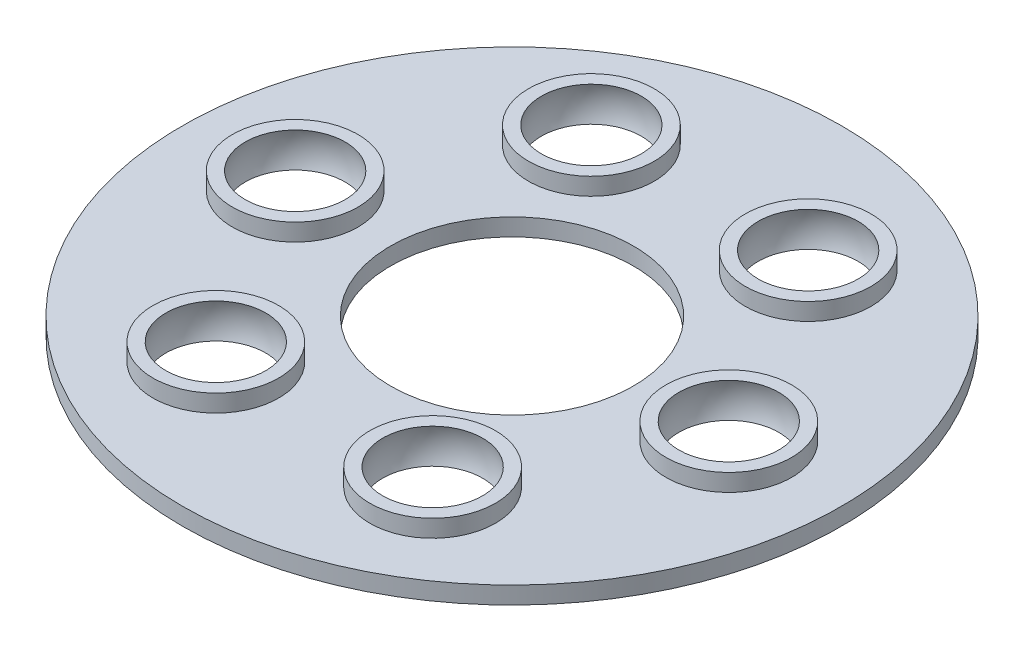
ISO-10303-21;
HEADER;
FILE_DESCRIPTION(('STEP AP214'),'2;1');
FILE_NAME('part.step','',(''),(''),'','','');
FILE_SCHEMA(('AUTOMOTIVE_DESIGN { 1 0 10303 214 1 1 1 1 }'));
ENDSEC;
DATA;
#1=APPLICATION_CONTEXT('core data for automotive mechanical design processes');
#2=APPLICATION_PROTOCOL_DEFINITION('international standard','automotive_design',2000,#1);
#3=PRODUCT_CONTEXT('',#1,'mechanical');
#4=PRODUCT('Part','Part','',(#3));
#5=PRODUCT_RELATED_PRODUCT_CATEGORY('part','',(#4));
#6=PRODUCT_DEFINITION_FORMATION('','',#4);
#7=PRODUCT_DEFINITION_CONTEXT('part definition',#1,'design');
#8=PRODUCT_DEFINITION('design','',#6,#7);
#9=PRODUCT_DEFINITION_SHAPE('','',#8);
#10=(LENGTH_UNIT() NAMED_UNIT(*) SI_UNIT(.MILLI.,.METRE.));
#11=(NAMED_UNIT(*) PLANE_ANGLE_UNIT() SI_UNIT($,.RADIAN.));
#12=(NAMED_UNIT(*) SI_UNIT($,.STERADIAN.) SOLID_ANGLE_UNIT());
#13=UNCERTAINTY_MEASURE_WITH_UNIT(LENGTH_MEASURE(1.E-05),#10,'distance_accuracy_value','');
#14=(GEOMETRIC_REPRESENTATION_CONTEXT(3) GLOBAL_UNCERTAINTY_ASSIGNED_CONTEXT((#13)) GLOBAL_UNIT_ASSIGNED_CONTEXT((#10,
#11,#12)) REPRESENTATION_CONTEXT('',''));
#15=CARTESIAN_POINT('',(0.,0.,0.));
#16=DIRECTION('',(0.,0.,1.));
#17=DIRECTION('',(1.,0.,0.));
#18=AXIS2_PLACEMENT_3D('',#15,#16,#17);
#19=CARTESIAN_POINT('',(0.,1.,0.));
#20=DIRECTION('',(0.,1.,0.));
#21=DIRECTION('',(0.,0.,1.));
#22=AXIS2_PLACEMENT_3D('',#19,#20,#21);
#23=PLANE('',#22);
#24=CARTESIAN_POINT('',(6.2499999999999,1.,-10.8253175473055));
#25=DIRECTION('',(0.,1.,0.));
#26=DIRECTION('',(-0.499999999999992,0.,0.866025403784443));
#27=AXIS2_PLACEMENT_3D('',#24,#25,#26);
#28=CIRCLE('',#27,3.625);
#29=CARTESIAN_POINT('',(4.43749999999993,1.,-7.68597545858694));
#30=VERTEX_POINT('',#29);
#31=EDGE_CURVE('E146',#30,#30,#28,.T.);
#32=ORIENTED_EDGE('',*,*,#31,.F.);
#33=EDGE_LOOP('',(#32));
#34=FACE_BOUND('',#33,.T.);
#35=CARTESIAN_POINT('',(6.25000000000005,1.,10.8253175473055));
#36=DIRECTION('',(0.,1.,0.));
#37=DIRECTION('',(-0.500000000000004,0.,-0.866025403784436));
#38=AXIS2_PLACEMENT_3D('',#35,#36,#37);
#39=CIRCLE('',#38,3.625);
#40=CARTESIAN_POINT('',(4.43750000000004,1.,7.68597545858687));
#41=VERTEX_POINT('',#40);
#42=EDGE_CURVE('E162',#41,#41,#39,.T.);
#43=ORIENTED_EDGE('',*,*,#42,.F.);
#44=EDGE_LOOP('',(#43));
#45=FACE_BOUND('',#44,.T.);
#46=CARTESIAN_POINT('',(-12.5,1.,0.));
#47=DIRECTION('',(0.,1.,0.));
#48=DIRECTION('',(1.,0.,0.));
#49=AXIS2_PLACEMENT_3D('',#46,#47,#48);
#50=CIRCLE('',#49,3.625);
#51=CARTESIAN_POINT('',(-8.875,1.,0.));
#52=VERTEX_POINT('',#51);
#53=EDGE_CURVE('E183',#52,#52,#50,.T.);
#54=ORIENTED_EDGE('',*,*,#53,.F.);
#55=EDGE_LOOP('',(#54));
#56=FACE_BOUND('',#55,.T.);
#57=CARTESIAN_POINT('',(0.,1.,0.));
#58=DIRECTION('',(0.,1.,0.));
#59=DIRECTION('',(0.,0.,1.));
#60=AXIS2_PLACEMENT_3D('',#57,#58,#59);
#61=CIRCLE('',#60,19.);
#62=CARTESIAN_POINT('',(0.,1.,19.));
#63=VERTEX_POINT('',#62);
#64=EDGE_CURVE('E11',#63,#63,#61,.T.);
#65=ORIENTED_EDGE('',*,*,#64,.T.);
#66=EDGE_LOOP('',(#65));
#67=FACE_BOUND('',#66,.T.);
#68=CARTESIAN_POINT('',(0.,1.,0.));
#69=DIRECTION('',(0.,1.,0.));
#70=DIRECTION('',(0.,0.,1.));
#71=AXIS2_PLACEMENT_3D('',#68,#69,#70);
#72=CIRCLE('',#71,7.);
#73=CARTESIAN_POINT('',(0.,1.,7.));
#74=VERTEX_POINT('',#73);
#75=EDGE_CURVE('E88',#74,#74,#72,.T.);
#76=ORIENTED_EDGE('',*,*,#75,.F.);
#77=EDGE_LOOP('',(#76));
#78=FACE_BOUND('',#77,.T.);
#79=CARTESIAN_POINT('',(-6.24999999999998,1.,10.8253175473055));
#80=DIRECTION('',(0.,1.,0.));
#81=DIRECTION('',(0.499999999999998,0.,-0.86602540378444));
#82=AXIS2_PLACEMENT_3D('',#79,#80,#81);
#83=CIRCLE('',#82,3.625);
#84=CARTESIAN_POINT('',(-4.43749999999998,1.,7.6859754585869));
#85=VERTEX_POINT('',#84);
#86=EDGE_CURVE('E170',#85,#85,#83,.T.);
#87=ORIENTED_EDGE('',*,*,#86,.F.);
#88=EDGE_LOOP('',(#87));
#89=FACE_BOUND('',#88,.T.);
#90=CARTESIAN_POINT('',(12.5,1.,0.));
#91=DIRECTION('',(0.,1.,0.));
#92=DIRECTION('',(-1.,0.,0.));
#93=AXIS2_PLACEMENT_3D('',#90,#91,#92);
#94=CIRCLE('',#93,3.625);
#95=CARTESIAN_POINT('',(8.875,1.,0.));
#96=VERTEX_POINT('',#95);
#97=EDGE_CURVE('E154',#96,#96,#94,.T.);
#98=ORIENTED_EDGE('',*,*,#97,.F.);
#99=EDGE_LOOP('',(#98));
#100=FACE_BOUND('',#99,.T.);
#101=CARTESIAN_POINT('',(-6.25000000000013,1.,-10.8253175473054));
#102=DIRECTION('',(0.,1.,0.));
#103=DIRECTION('',(0.50000000000001,0.,0.866025403784433));
#104=AXIS2_PLACEMENT_3D('',#101,#102,#103);
#105=CIRCLE('',#104,3.625);
#106=CARTESIAN_POINT('',(-4.43750000000009,1.,-7.68597545858684));
#107=VERTEX_POINT('',#106);
#108=EDGE_CURVE('E141',#107,#107,#105,.T.);
#109=ORIENTED_EDGE('',*,*,#108,.F.);
#110=EDGE_LOOP('',(#109));
#111=FACE_BOUND('',#110,.T.);
#112=ADVANCED_FACE('F73',(#34,#45,#56,#67,#78,#89,#100,#111),#23,.T.);
#113=CARTESIAN_POINT('',(0.,0.,0.));
#114=DIRECTION('',(0.,1.,0.));
#115=DIRECTION('',(0.,0.,1.));
#116=AXIS2_PLACEMENT_3D('',#113,#114,#115);
#117=PLANE('',#116);
#118=CARTESIAN_POINT('',(-6.25000000000013,0.,-10.8253175473054));
#119=DIRECTION('',(0.,1.,0.));
#120=DIRECTION('',(0.,0.,1.));
#121=AXIS2_PLACEMENT_3D('',#118,#119,#120);
#122=CIRCLE('',#121,2.88140590684478);
#123=CARTESIAN_POINT('',(-6.25000000000013,0.,-7.94391164046063));
#124=VERTEX_POINT('',#123);
#125=EDGE_CURVE('E118',#124,#124,#122,.T.);
#126=ORIENTED_EDGE('',*,*,#125,.T.);
#127=EDGE_LOOP('',(#126));
#128=FACE_BOUND('',#127,.T.);
#129=CARTESIAN_POINT('',(6.2499999999999,0.,-10.8253175473055));
#130=DIRECTION('',(0.,1.,0.));
#131=DIRECTION('',(0.,0.,1.));
#132=AXIS2_PLACEMENT_3D('',#129,#130,#131);
#133=CIRCLE('',#132,2.88140590684478);
#134=CARTESIAN_POINT('',(6.2499999999999,0.,-7.94391164046076));
#135=VERTEX_POINT('',#134);
#136=EDGE_CURVE('E114',#135,#135,#133,.T.);
#137=ORIENTED_EDGE('',*,*,#136,.T.);
#138=EDGE_LOOP('',(#137));
#139=FACE_BOUND('',#138,.T.);
#140=CARTESIAN_POINT('',(12.5,0.,0.));
#141=DIRECTION('',(0.,1.,0.));
#142=DIRECTION('',(0.,0.,1.));
#143=AXIS2_PLACEMENT_3D('',#140,#141,#142);
#144=CIRCLE('',#143,2.88140590684478);
#145=CARTESIAN_POINT('',(12.5,0.,2.88140590684478));
#146=VERTEX_POINT('',#145);
#147=EDGE_CURVE('E110',#146,#146,#144,.T.);
#148=ORIENTED_EDGE('',*,*,#147,.T.);
#149=EDGE_LOOP('',(#148));
#150=FACE_BOUND('',#149,.T.);
#151=CARTESIAN_POINT('',(6.25000000000005,0.,10.8253175473055));
#152=DIRECTION('',(0.,1.,0.));
#153=DIRECTION('',(0.,0.,1.));
#154=AXIS2_PLACEMENT_3D('',#151,#152,#153);
#155=CIRCLE('',#154,2.88140590684478);
#156=CARTESIAN_POINT('',(6.25000000000005,0.,13.7067234541502));
#157=VERTEX_POINT('',#156);
#158=EDGE_CURVE('E105',#157,#157,#155,.T.);
#159=ORIENTED_EDGE('',*,*,#158,.T.);
#160=EDGE_LOOP('',(#159));
#161=FACE_BOUND('',#160,.T.);
#162=CARTESIAN_POINT('',(-6.24999999999998,0.,10.8253175473055));
#163=DIRECTION('',(0.,1.,0.));
#164=DIRECTION('',(0.,0.,1.));
#165=AXIS2_PLACEMENT_3D('',#162,#163,#164);
#166=CIRCLE('',#165,2.88140590684478);
#167=CARTESIAN_POINT('',(-6.24999999999998,0.,13.7067234541503));
#168=VERTEX_POINT('',#167);
#169=EDGE_CURVE('E104',#168,#168,#166,.T.);
#170=ORIENTED_EDGE('',*,*,#169,.T.);
#171=EDGE_LOOP('',(#170));
#172=FACE_BOUND('',#171,.T.);
#173=CARTESIAN_POINT('',(-12.5,0.,0.));
#174=DIRECTION('',(0.,1.,0.));
#175=DIRECTION('',(0.,0.,1.));
#176=AXIS2_PLACEMENT_3D('',#173,#174,#175);
#177=CIRCLE('',#176,2.88140590684478);
#178=CARTESIAN_POINT('',(-12.5,0.,2.88140590684478));
#179=VERTEX_POINT('',#178);
#180=EDGE_CURVE('E98',#179,#179,#177,.T.);
#181=ORIENTED_EDGE('',*,*,#180,.T.);
#182=EDGE_LOOP('',(#181));
#183=FACE_BOUND('',#182,.T.);
#184=CARTESIAN_POINT('',(0.,0.,0.));
#185=DIRECTION('',(0.,1.,0.));
#186=DIRECTION('',(0.,0.,1.));
#187=AXIS2_PLACEMENT_3D('',#184,#185,#186);
#188=CIRCLE('',#187,19.);
#189=CARTESIAN_POINT('',(0.,0.,19.));
#190=VERTEX_POINT('',#189);
#191=EDGE_CURVE('E82',#190,#190,#188,.T.);
#192=ORIENTED_EDGE('',*,*,#191,.F.);
#193=EDGE_LOOP('',(#192));
#194=FACE_BOUND('',#193,.T.);
#195=CARTESIAN_POINT('',(0.,0.,0.));
#196=DIRECTION('',(0.,1.,0.));
#197=DIRECTION('',(0.,0.,1.));
#198=AXIS2_PLACEMENT_3D('',#195,#196,#197);
#199=CIRCLE('',#198,7.);
#200=CARTESIAN_POINT('',(0.,0.,7.));
#201=VERTEX_POINT('',#200);
#202=EDGE_CURVE('E91',#201,#201,#199,.T.);
#203=ORIENTED_EDGE('',*,*,#202,.T.);
#204=EDGE_LOOP('',(#203));
#205=FACE_BOUND('',#204,.T.);
#206=ADVANCED_FACE('F198',(#128,#139,#150,#161,#172,#183,#194,#205),#117,.F.);
#207=CARTESIAN_POINT('',(0.,1.,0.));
#208=DIRECTION('',(0.,-1.,0.));
#209=DIRECTION('',(0.,0.,-1.));
#210=AXIS2_PLACEMENT_3D('',#207,#208,#209);
#211=CYLINDRICAL_SURFACE('',#210,19.);
#212=ORIENTED_EDGE('',*,*,#64,.F.);
#213=EDGE_LOOP('',(#212));
#214=FACE_BOUND('',#213,.T.);
#215=ORIENTED_EDGE('',*,*,#191,.T.);
#216=EDGE_LOOP('',(#215));
#217=FACE_BOUND('',#216,.T.);
#218=ADVANCED_FACE('F75',(#214,#217),#211,.T.);
#219=CARTESIAN_POINT('',(0.,1.,0.));
#220=DIRECTION('',(0.,-1.,0.));
#221=DIRECTION('',(0.,0.,-1.));
#222=AXIS2_PLACEMENT_3D('',#219,#220,#221);
#223=CYLINDRICAL_SURFACE('',#222,7.);
#224=ORIENTED_EDGE('',*,*,#75,.T.);
#225=EDGE_LOOP('',(#224));
#226=FACE_BOUND('',#225,.T.);
#227=ORIENTED_EDGE('',*,*,#202,.F.);
#228=EDGE_LOOP('',(#227));
#229=FACE_BOUND('',#228,.T.);
#230=ADVANCED_FACE('F200',(#226,#229),#223,.F.);
#231=CARTESIAN_POINT('',(-12.5,2.,0.));
#232=DIRECTION('',(0.,1.,0.));
#233=DIRECTION('',(0.,0.,1.));
#234=AXIS2_PLACEMENT_3D('',#231,#232,#233);
#235=PLANE('',#234);
#236=CARTESIAN_POINT('',(-12.5,2.,0.));
#237=DIRECTION('',(0.,1.,0.));
#238=DIRECTION('',(0.,0.,1.));
#239=AXIS2_PLACEMENT_3D('',#236,#237,#238);
#240=CIRCLE('',#239,2.88140590684478);
#241=CARTESIAN_POINT('',(-12.5,2.,2.88140590684478));
#242=VERTEX_POINT('',#241);
#243=EDGE_CURVE('E94',#242,#242,#240,.T.);
#244=ORIENTED_EDGE('',*,*,#243,.F.);
#245=EDGE_LOOP('',(#244));
#246=FACE_BOUND('',#245,.T.);
#247=CARTESIAN_POINT('',(-12.5,2.,0.));
#248=DIRECTION('',(0.,1.,0.));
#249=DIRECTION('',(1.,0.,0.));
#250=AXIS2_PLACEMENT_3D('',#247,#248,#249);
#251=CIRCLE('',#250,3.625);
#252=CARTESIAN_POINT('',(-8.875,2.,0.));
#253=VERTEX_POINT('',#252);
#254=EDGE_CURVE('E184',#253,#253,#251,.T.);
#255=ORIENTED_EDGE('',*,*,#254,.T.);
#256=EDGE_LOOP('',(#255));
#257=FACE_BOUND('',#256,.T.);
#258=ADVANCED_FACE('F202',(#246,#257),#235,.T.);
#259=CARTESIAN_POINT('',(-12.5,2.,0.));
#260=DIRECTION('',(0.,-1.,0.));
#261=DIRECTION('',(0.,0.,-1.));
#262=AXIS2_PLACEMENT_3D('',#259,#260,#261);
#263=CYLINDRICAL_SURFACE('',#262,3.625);
#264=ORIENTED_EDGE('',*,*,#254,.F.);
#265=EDGE_LOOP('',(#264));
#266=FACE_BOUND('',#265,.T.);
#267=ORIENTED_EDGE('',*,*,#53,.T.);
#268=EDGE_LOOP('',(#267));
#269=FACE_BOUND('',#268,.T.);
#270=ADVANCED_FACE('F208',(#266,#269),#263,.T.);
#271=CARTESIAN_POINT('',(-12.5,1.,0.));
#272=DIRECTION('',(1.,0.,0.));
#273=DIRECTION('',(0.,0.,-1.));
#274=AXIS2_PLACEMENT_3D('',#271,#272,#273);
#275=SPHERICAL_SURFACE('',#274,3.05);
#276=CARTESIAN_POINT('',(-12.5,1.,0.));
#277=DIRECTION('',(0.,1.,0.));
#278=DIRECTION('',(0.,0.,1.));
#279=AXIS2_PLACEMENT_3D('',#276,#277,#278);
#280=SPHERICAL_SURFACE('',#279,3.05);
#281=ORIENTED_EDGE('',*,*,#243,.T.);
#282=EDGE_LOOP('',(#281));
#283=FACE_BOUND('',#282,.T.);
#284=ORIENTED_EDGE('',*,*,#180,.F.);
#285=EDGE_LOOP('',(#284));
#286=FACE_BOUND('',#285,.T.);
#287=ADVANCED_FACE('F277',(#283,#286),#280,.F.);
#288=CARTESIAN_POINT('',(-6.24999999999998,2.,10.8253175473055));
#289=DIRECTION('',(0.,1.,0.));
#290=DIRECTION('',(0.,0.,1.));
#291=AXIS2_PLACEMENT_3D('',#288,#289,#290);
#292=PLANE('',#291);
#293=CARTESIAN_POINT('',(-6.24999999999998,2.,10.8253175473055));
#294=DIRECTION('',(0.,1.,0.));
#295=DIRECTION('',(0.,0.,1.));
#296=AXIS2_PLACEMENT_3D('',#293,#294,#295);
#297=CIRCLE('',#296,2.88140590684478);
#298=CARTESIAN_POINT('',(-6.24999999999998,2.,13.7067234541503));
#299=VERTEX_POINT('',#298);
#300=EDGE_CURVE('E100',#299,#299,#297,.T.);
#301=ORIENTED_EDGE('',*,*,#300,.F.);
#302=EDGE_LOOP('',(#301));
#303=FACE_BOUND('',#302,.T.);
#304=CARTESIAN_POINT('',(-6.24999999999998,2.,10.8253175473055));
#305=DIRECTION('',(0.,1.,0.));
#306=DIRECTION('',(0.499999999999998,0.,-0.86602540378444));
#307=AXIS2_PLACEMENT_3D('',#304,#305,#306);
#308=CIRCLE('',#307,3.625);
#309=CARTESIAN_POINT('',(-4.43749999999998,2.,7.6859754585869));
#310=VERTEX_POINT('',#309);
#311=EDGE_CURVE('E99',#310,#310,#308,.T.);
#312=ORIENTED_EDGE('',*,*,#311,.T.);
#313=EDGE_LOOP('',(#312));
#314=FACE_BOUND('',#313,.T.);
#315=ADVANCED_FACE('F274',(#303,#314),#292,.T.);
#316=CARTESIAN_POINT('',(-6.24999999999998,2.,10.8253175473055));
#317=DIRECTION('',(0.,-1.,0.));
#318=DIRECTION('',(0.,0.,-1.));
#319=AXIS2_PLACEMENT_3D('',#316,#317,#318);
#320=CYLINDRICAL_SURFACE('',#319,3.625);
#321=ORIENTED_EDGE('',*,*,#311,.F.);
#322=EDGE_LOOP('',(#321));
#323=FACE_BOUND('',#322,.T.);
#324=ORIENTED_EDGE('',*,*,#86,.T.);
#325=EDGE_LOOP('',(#324));
#326=FACE_BOUND('',#325,.T.);
#327=ADVANCED_FACE('F269',(#323,#326),#320,.T.);
#328=CARTESIAN_POINT('',(6.25000000000005,2.,10.8253175473055));
#329=DIRECTION('',(0.,1.,0.));
#330=DIRECTION('',(0.,0.,1.));
#331=AXIS2_PLACEMENT_3D('',#328,#329,#330);
#332=PLANE('',#331);
#333=CARTESIAN_POINT('',(6.25000000000005,2.,10.8253175473055));
#334=DIRECTION('',(0.,1.,0.));
#335=DIRECTION('',(0.,0.,1.));
#336=AXIS2_PLACEMENT_3D('',#333,#334,#335);
#337=CIRCLE('',#336,2.88140590684478);
#338=CARTESIAN_POINT('',(6.25000000000005,2.,13.7067234541502));
#339=VERTEX_POINT('',#338);
#340=EDGE_CURVE('E106',#339,#339,#337,.T.);
#341=ORIENTED_EDGE('',*,*,#340,.F.);
#342=EDGE_LOOP('',(#341));
#343=FACE_BOUND('',#342,.T.);
#344=CARTESIAN_POINT('',(6.25000000000005,2.,10.8253175473055));
#345=DIRECTION('',(0.,1.,0.));
#346=DIRECTION('',(-0.500000000000004,0.,-0.866025403784436));
#347=AXIS2_PLACEMENT_3D('',#344,#345,#346);
#348=CIRCLE('',#347,3.625);
#349=CARTESIAN_POINT('',(4.43750000000004,2.,7.68597545858687));
#350=VERTEX_POINT('',#349);
#351=EDGE_CURVE('E166',#350,#350,#348,.T.);
#352=ORIENTED_EDGE('',*,*,#351,.T.);
#353=EDGE_LOOP('',(#352));
#354=FACE_BOUND('',#353,.T.);
#355=ADVANCED_FACE('F266',(#343,#354),#332,.T.);
#356=CARTESIAN_POINT('',(6.25000000000005,2.,10.8253175473055));
#357=DIRECTION('',(0.,-1.,0.));
#358=DIRECTION('',(0.,0.,-1.));
#359=AXIS2_PLACEMENT_3D('',#356,#357,#358);
#360=CYLINDRICAL_SURFACE('',#359,3.625);
#361=ORIENTED_EDGE('',*,*,#351,.F.);
#362=EDGE_LOOP('',(#361));
#363=FACE_BOUND('',#362,.T.);
#364=ORIENTED_EDGE('',*,*,#42,.T.);
#365=EDGE_LOOP('',(#364));
#366=FACE_BOUND('',#365,.T.);
#367=ADVANCED_FACE('F261',(#363,#366),#360,.T.);
#368=CARTESIAN_POINT('',(12.5,2.,0.));
#369=DIRECTION('',(0.,1.,0.));
#370=DIRECTION('',(0.,0.,1.));
#371=AXIS2_PLACEMENT_3D('',#368,#369,#370);
#372=PLANE('',#371);
#373=CARTESIAN_POINT('',(12.5,2.,0.));
#374=DIRECTION('',(0.,1.,0.));
#375=DIRECTION('',(0.,0.,1.));
#376=AXIS2_PLACEMENT_3D('',#373,#374,#375);
#377=CIRCLE('',#376,2.88140590684478);
#378=CARTESIAN_POINT('',(12.5,2.,2.88140590684478));
#379=VERTEX_POINT('',#378);
#380=EDGE_CURVE('E111',#379,#379,#377,.T.);
#381=ORIENTED_EDGE('',*,*,#380,.F.);
#382=EDGE_LOOP('',(#381));
#383=FACE_BOUND('',#382,.T.);
#384=CARTESIAN_POINT('',(12.5,2.,0.));
#385=DIRECTION('',(0.,1.,0.));
#386=DIRECTION('',(-1.,0.,0.));
#387=AXIS2_PLACEMENT_3D('',#384,#385,#386);
#388=CIRCLE('',#387,3.625);
#389=CARTESIAN_POINT('',(8.875,2.,0.));
#390=VERTEX_POINT('',#389);
#391=EDGE_CURVE('E158',#390,#390,#388,.T.);
#392=ORIENTED_EDGE('',*,*,#391,.T.);
#393=EDGE_LOOP('',(#392));
#394=FACE_BOUND('',#393,.T.);
#395=ADVANCED_FACE('F258',(#383,#394),#372,.T.);
#396=CARTESIAN_POINT('',(12.5,2.,0.));
#397=DIRECTION('',(0.,-1.,0.));
#398=DIRECTION('',(0.,0.,-1.));
#399=AXIS2_PLACEMENT_3D('',#396,#397,#398);
#400=CYLINDRICAL_SURFACE('',#399,3.625);
#401=ORIENTED_EDGE('',*,*,#391,.F.);
#402=EDGE_LOOP('',(#401));
#403=FACE_BOUND('',#402,.T.);
#404=ORIENTED_EDGE('',*,*,#97,.T.);
#405=EDGE_LOOP('',(#404));
#406=FACE_BOUND('',#405,.T.);
#407=ADVANCED_FACE('F253',(#403,#406),#400,.T.);
#408=CARTESIAN_POINT('',(6.2499999999999,2.,-10.8253175473055));
#409=DIRECTION('',(0.,1.,0.));
#410=DIRECTION('',(0.,0.,1.));
#411=AXIS2_PLACEMENT_3D('',#408,#409,#410);
#412=PLANE('',#411);
#413=CARTESIAN_POINT('',(6.2499999999999,2.,-10.8253175473055));
#414=DIRECTION('',(0.,1.,0.));
#415=DIRECTION('',(0.,0.,1.));
#416=AXIS2_PLACEMENT_3D('',#413,#414,#415);
#417=CIRCLE('',#416,2.88140590684478);
#418=CARTESIAN_POINT('',(6.2499999999999,2.,-7.94391164046076));
#419=VERTEX_POINT('',#418);
#420=EDGE_CURVE('E115',#419,#419,#417,.T.);
#421=ORIENTED_EDGE('',*,*,#420,.F.);
#422=EDGE_LOOP('',(#421));
#423=FACE_BOUND('',#422,.T.);
#424=CARTESIAN_POINT('',(6.2499999999999,2.,-10.8253175473055));
#425=DIRECTION('',(0.,1.,0.));
#426=DIRECTION('',(-0.499999999999992,0.,0.866025403784443));
#427=AXIS2_PLACEMENT_3D('',#424,#425,#426);
#428=CIRCLE('',#427,3.625);
#429=CARTESIAN_POINT('',(4.43749999999993,2.,-7.68597545858694));
#430=VERTEX_POINT('',#429);
#431=EDGE_CURVE('E150',#430,#430,#428,.T.);
#432=ORIENTED_EDGE('',*,*,#431,.T.);
#433=EDGE_LOOP('',(#432));
#434=FACE_BOUND('',#433,.T.);
#435=ADVANCED_FACE('F250',(#423,#434),#412,.T.);
#436=CARTESIAN_POINT('',(6.2499999999999,2.,-10.8253175473055));
#437=DIRECTION('',(0.,-1.,0.));
#438=DIRECTION('',(0.,0.,-1.));
#439=AXIS2_PLACEMENT_3D('',#436,#437,#438);
#440=CYLINDRICAL_SURFACE('',#439,3.625);
#441=ORIENTED_EDGE('',*,*,#431,.F.);
#442=EDGE_LOOP('',(#441));
#443=FACE_BOUND('',#442,.T.);
#444=ORIENTED_EDGE('',*,*,#31,.T.);
#445=EDGE_LOOP('',(#444));
#446=FACE_BOUND('',#445,.T.);
#447=ADVANCED_FACE('F245',(#443,#446),#440,.T.);
#448=CARTESIAN_POINT('',(-6.25000000000013,2.,-10.8253175473054));
#449=DIRECTION('',(0.,1.,0.));
#450=DIRECTION('',(0.,0.,1.));
#451=AXIS2_PLACEMENT_3D('',#448,#449,#450);
#452=PLANE('',#451);
#453=CARTESIAN_POINT('',(-6.25000000000013,2.,-10.8253175473054));
#454=DIRECTION('',(0.,1.,0.));
#455=DIRECTION('',(0.,0.,1.));
#456=AXIS2_PLACEMENT_3D('',#453,#454,#455);
#457=CIRCLE('',#456,2.88140590684478);
#458=CARTESIAN_POINT('',(-6.25000000000013,2.,-7.94391164046063));
#459=VERTEX_POINT('',#458);
#460=EDGE_CURVE('E77',#459,#459,#457,.T.);
#461=ORIENTED_EDGE('',*,*,#460,.F.);
#462=EDGE_LOOP('',(#461));
#463=FACE_BOUND('',#462,.T.);
#464=CARTESIAN_POINT('',(-6.25000000000013,2.,-10.8253175473054));
#465=DIRECTION('',(0.,1.,0.));
#466=DIRECTION('',(0.50000000000001,0.,0.866025403784433));
#467=AXIS2_PLACEMENT_3D('',#464,#465,#466);
#468=CIRCLE('',#467,3.625);
#469=CARTESIAN_POINT('',(-4.43750000000009,2.,-7.68597545858684));
#470=VERTEX_POINT('',#469);
#471=EDGE_CURVE('E142',#470,#470,#468,.T.);
#472=ORIENTED_EDGE('',*,*,#471,.T.);
#473=EDGE_LOOP('',(#472));
#474=FACE_BOUND('',#473,.T.);
#475=ADVANCED_FACE('F235',(#463,#474),#452,.T.);
#476=CARTESIAN_POINT('',(-6.25000000000013,2.,-10.8253175473054));
#477=DIRECTION('',(0.,-1.,0.));
#478=DIRECTION('',(0.,0.,-1.));
#479=AXIS2_PLACEMENT_3D('',#476,#477,#478);
#480=CYLINDRICAL_SURFACE('',#479,3.625);
#481=ORIENTED_EDGE('',*,*,#471,.F.);
#482=EDGE_LOOP('',(#481));
#483=FACE_BOUND('',#482,.T.);
#484=ORIENTED_EDGE('',*,*,#108,.T.);
#485=EDGE_LOOP('',(#484));
#486=FACE_BOUND('',#485,.T.);
#487=ADVANCED_FACE('F232',(#483,#486),#480,.T.);
#488=CARTESIAN_POINT('',(-6.24999999999998,1.,10.8253175473055));
#489=DIRECTION('',(0.499999999999998,0.,-0.86602540378444));
#490=DIRECTION('',(-0.86602540378444,0.,-0.499999999999998));
#491=AXIS2_PLACEMENT_3D('',#488,#489,#490);
#492=SPHERICAL_SURFACE('',#491,3.05);
#493=CARTESIAN_POINT('',(-6.24999999999998,1.,10.8253175473055));
#494=DIRECTION('',(0.,1.,0.));
#495=DIRECTION('',(0.,0.,1.));
#496=AXIS2_PLACEMENT_3D('',#493,#494,#495);
#497=SPHERICAL_SURFACE('',#496,3.05);
#498=ORIENTED_EDGE('',*,*,#300,.T.);
#499=EDGE_LOOP('',(#498));
#500=FACE_BOUND('',#499,.T.);
#501=ORIENTED_EDGE('',*,*,#169,.F.);
#502=EDGE_LOOP('',(#501));
#503=FACE_BOUND('',#502,.T.);
#504=ADVANCED_FACE('F234',(#500,#503),#497,.F.);
#505=CARTESIAN_POINT('',(6.25000000000005,1.,10.8253175473055));
#506=DIRECTION('',(-0.500000000000004,0.,-0.866025403784437));
#507=DIRECTION('',(-0.866025403784437,0.,0.500000000000004));
#508=AXIS2_PLACEMENT_3D('',#505,#506,#507);
#509=SPHERICAL_SURFACE('',#508,3.05);
#510=CARTESIAN_POINT('',(6.25000000000005,1.,10.8253175473055));
#511=DIRECTION('',(0.,1.,0.));
#512=DIRECTION('',(0.,0.,1.));
#513=AXIS2_PLACEMENT_3D('',#510,#511,#512);
#514=SPHERICAL_SURFACE('',#513,3.05);
#515=ORIENTED_EDGE('',*,*,#340,.T.);
#516=EDGE_LOOP('',(#515));
#517=FACE_BOUND('',#516,.T.);
#518=ORIENTED_EDGE('',*,*,#158,.F.);
#519=EDGE_LOOP('',(#518));
#520=FACE_BOUND('',#519,.T.);
#521=ADVANCED_FACE('F242',(#517,#520),#514,.F.);
#522=CARTESIAN_POINT('',(12.5,1.,0.));
#523=DIRECTION('',(-1.,0.,0.));
#524=DIRECTION('',(0.,0.,1.));
#525=AXIS2_PLACEMENT_3D('',#522,#523,#524);
#526=SPHERICAL_SURFACE('',#525,3.05);
#527=CARTESIAN_POINT('',(12.5,1.,0.));
#528=DIRECTION('',(0.,1.,0.));
#529=DIRECTION('',(0.,0.,1.));
#530=AXIS2_PLACEMENT_3D('',#527,#528,#529);
#531=SPHERICAL_SURFACE('',#530,3.05);
#532=ORIENTED_EDGE('',*,*,#380,.T.);
#533=EDGE_LOOP('',(#532));
#534=FACE_BOUND('',#533,.T.);
#535=ORIENTED_EDGE('',*,*,#147,.F.);
#536=EDGE_LOOP('',(#535));
#537=FACE_BOUND('',#536,.T.);
#538=ADVANCED_FACE('F353',(#534,#537),#531,.F.);
#539=CARTESIAN_POINT('',(6.2499999999999,1.,-10.8253175473055));
#540=DIRECTION('',(-0.499999999999992,0.,0.866025403784443));
#541=DIRECTION('',(0.866025403784443,0.,0.499999999999992));
#542=AXIS2_PLACEMENT_3D('',#539,#540,#541);
#543=SPHERICAL_SURFACE('',#542,3.05);
#544=CARTESIAN_POINT('',(6.2499999999999,1.,-10.8253175473055));
#545=DIRECTION('',(0.,1.,0.));
#546=DIRECTION('',(0.,0.,1.));
#547=AXIS2_PLACEMENT_3D('',#544,#545,#546);
#548=SPHERICAL_SURFACE('',#547,3.05);
#549=ORIENTED_EDGE('',*,*,#420,.T.);
#550=EDGE_LOOP('',(#549));
#551=FACE_BOUND('',#550,.T.);
#552=ORIENTED_EDGE('',*,*,#136,.F.);
#553=EDGE_LOOP('',(#552));
#554=FACE_BOUND('',#553,.T.);
#555=ADVANCED_FACE('F363',(#551,#554),#548,.F.);
#556=CARTESIAN_POINT('',(-6.25000000000013,1.,-10.8253175473054));
#557=DIRECTION('',(0.50000000000001,0.,0.866025403784433));
#558=DIRECTION('',(0.866025403784433,0.,-0.50000000000001));
#559=AXIS2_PLACEMENT_3D('',#556,#557,#558);
#560=SPHERICAL_SURFACE('',#559,3.05);
#561=CARTESIAN_POINT('',(-6.25000000000013,1.,-10.8253175473054));
#562=DIRECTION('',(0.,1.,0.));
#563=DIRECTION('',(0.,0.,1.));
#564=AXIS2_PLACEMENT_3D('',#561,#562,#563);
#565=SPHERICAL_SURFACE('',#564,3.05);
#566=ORIENTED_EDGE('',*,*,#460,.T.);
#567=EDGE_LOOP('',(#566));
#568=FACE_BOUND('',#567,.T.);
#569=ORIENTED_EDGE('',*,*,#125,.F.);
#570=EDGE_LOOP('',(#569));
#571=FACE_BOUND('',#570,.T.);
#572=ADVANCED_FACE('F373',(#568,#571),#565,.F.);
#573=CLOSED_SHELL('',(#112,#206,#218,#230,#258,#270,#287,#315,#327,#355,#367,#395,#407,#435,
#447,#475,#487,#504,#521,#538,#555,#572));
#574=MANIFOLD_SOLID_BREP('B2',#573);
#575=ADVANCED_BREP_SHAPE_REPRESENTATION('',(#18,#574),#14);
#576=SHAPE_DEFINITION_REPRESENTATION(#9,#575);
ENDSEC;
END-ISO-10303-21;
